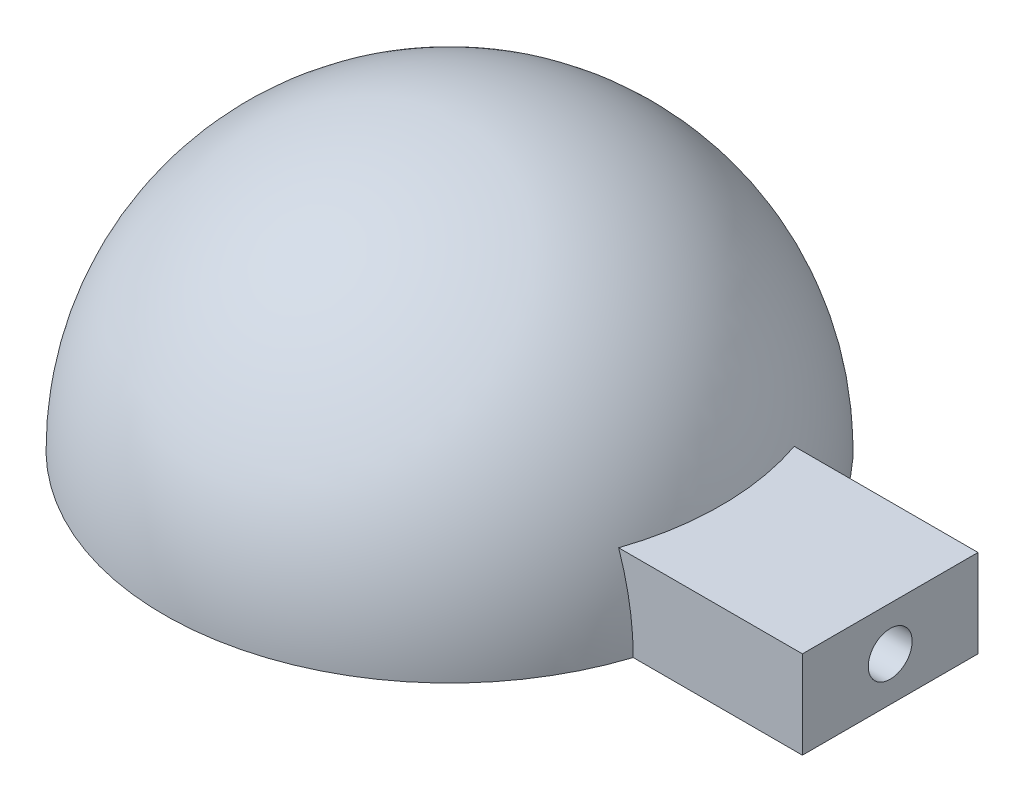
ISO-10303-21;
HEADER;
FILE_DESCRIPTION(('STEP AP214'),'2;1');
FILE_NAME('part.step','',(''),(''),'','','');
FILE_SCHEMA(('AUTOMOTIVE_DESIGN { 1 0 10303 214 1 1 1 1 }'));
ENDSEC;
DATA;
#1=APPLICATION_CONTEXT('core data for automotive mechanical design processes');
#2=APPLICATION_PROTOCOL_DEFINITION('international standard','automotive_design',2000,#1);
#3=PRODUCT_CONTEXT('',#1,'mechanical');
#4=PRODUCT('Part','Part','',(#3));
#5=PRODUCT_RELATED_PRODUCT_CATEGORY('part','',(#4));
#6=PRODUCT_DEFINITION_FORMATION('','',#4);
#7=PRODUCT_DEFINITION_CONTEXT('part definition',#1,'design');
#8=PRODUCT_DEFINITION('design','',#6,#7);
#9=PRODUCT_DEFINITION_SHAPE('','',#8);
#10=(LENGTH_UNIT() NAMED_UNIT(*) SI_UNIT(.MILLI.,.METRE.));
#11=(NAMED_UNIT(*) PLANE_ANGLE_UNIT() SI_UNIT($,.RADIAN.));
#12=(NAMED_UNIT(*) SI_UNIT($,.STERADIAN.) SOLID_ANGLE_UNIT());
#13=UNCERTAINTY_MEASURE_WITH_UNIT(LENGTH_MEASURE(1.E-05),#10,'distance_accuracy_value','');
#14=(GEOMETRIC_REPRESENTATION_CONTEXT(3) GLOBAL_UNCERTAINTY_ASSIGNED_CONTEXT((#13)) GLOBAL_UNIT_ASSIGNED_CONTEXT((#10,
#11,#12)) REPRESENTATION_CONTEXT('',''));
#15=CARTESIAN_POINT('',(0.,0.,0.));
#16=DIRECTION('',(0.,0.,1.));
#17=DIRECTION('',(1.,0.,0.));
#18=AXIS2_PLACEMENT_3D('',#15,#16,#17);
#19=CARTESIAN_POINT('',(0.,0.,0.));
#20=DIRECTION('',(0.,-1.,0.));
#21=DIRECTION('',(-1.,0.,0.));
#22=AXIS2_PLACEMENT_3D('',#19,#20,#21);
#23=SPHERICAL_SURFACE('',#22,6.5);
#24=CARTESIAN_POINT('',(0.,2.,0.));
#25=DIRECTION('',(0.,-1.,0.));
#26=DIRECTION('',(0.,0.,-1.));
#27=AXIS2_PLACEMENT_3D('',#24,#25,#26);
#28=CIRCLE('',#27,6.18465843842649);
#29=CARTESIAN_POINT('',(5.85234995535981,2.,-2.));
#30=VERTEX_POINT('',#29);
#31=CARTESIAN_POINT('',(5.85234995535981,2.,2.));
#32=VERTEX_POINT('',#31);
#33=EDGE_CURVE('E11',#30,#32,#28,.T.);
#34=ORIENTED_EDGE('',*,*,#33,.F.);
#35=CARTESIAN_POINT('',(0.,0.,-2.));
#36=DIRECTION('',(0.,0.,-1.));
#37=DIRECTION('',(-1.,0.,0.));
#38=AXIS2_PLACEMENT_3D('',#35,#36,#37);
#39=CIRCLE('',#38,6.18465843842649);
#40=CARTESIAN_POINT('',(6.18465843842649,0.,-2.));
#41=VERTEX_POINT('',#40);
#42=EDGE_CURVE('E57',#30,#41,#39,.T.);
#43=ORIENTED_EDGE('',*,*,#42,.T.);
#44=CARTESIAN_POINT('',(0.,0.,0.));
#45=DIRECTION('',(0.,-1.,0.));
#46=DIRECTION('',(0.,0.,-1.));
#47=AXIS2_PLACEMENT_3D('',#44,#45,#46);
#48=CIRCLE('',#47,6.5);
#49=CARTESIAN_POINT('',(6.18465843842649,0.,2.));
#50=VERTEX_POINT('',#49);
#51=EDGE_CURVE('E42',#50,#41,#48,.T.);
#52=ORIENTED_EDGE('',*,*,#51,.F.);
#53=CARTESIAN_POINT('',(0.,0.,2.));
#54=DIRECTION('',(0.,0.,-1.));
#55=DIRECTION('',(-1.,0.,0.));
#56=AXIS2_PLACEMENT_3D('',#53,#54,#55);
#57=CIRCLE('',#56,6.18465843842649);
#58=EDGE_CURVE('E107',#32,#50,#57,.T.);
#59=ORIENTED_EDGE('',*,*,#58,.F.);
#60=EDGE_LOOP('',(#34,#43,#52,#59));
#61=FACE_BOUND('',#60,.T.);
#62=ADVANCED_FACE('F35',(#61),#23,.T.);
#63=CARTESIAN_POINT('',(0.,0.,0.));
#64=DIRECTION('',(0.,-1.,0.));
#65=DIRECTION('',(0.,0.,-1.));
#66=AXIS2_PLACEMENT_3D('',#63,#64,#65);
#67=PLANE('',#66);
#68=ORIENTED_EDGE('',*,*,#51,.T.);
#69=DIRECTION('',(1.,0.,0.));
#70=VECTOR('',#69,1.);
#71=CARTESIAN_POINT('',(0.,0.,-2.));
#72=LINE('',#71,#70);
#73=CARTESIAN_POINT('',(10.0376342047566,0.,-2.));
#74=VERTEX_POINT('',#73);
#75=EDGE_CURVE('E95',#41,#74,#72,.T.);
#76=ORIENTED_EDGE('',*,*,#75,.T.);
#77=DIRECTION('',(0.,0.,-1.));
#78=VECTOR('',#77,1.);
#79=CARTESIAN_POINT('',(10.0376342047566,0.,0.));
#80=LINE('',#79,#78);
#81=CARTESIAN_POINT('',(10.0376342047566,0.,2.));
#82=VERTEX_POINT('',#81);
#83=EDGE_CURVE('E103',#82,#74,#80,.T.);
#84=ORIENTED_EDGE('',*,*,#83,.F.);
#85=DIRECTION('',(1.,0.,0.));
#86=VECTOR('',#85,1.);
#87=CARTESIAN_POINT('',(0.,0.,2.));
#88=LINE('',#87,#86);
#89=EDGE_CURVE('E49',#50,#82,#88,.T.);
#90=ORIENTED_EDGE('',*,*,#89,.F.);
#91=EDGE_LOOP('',(#68,#76,#84,#90));
#92=FACE_BOUND('',#91,.T.);
#93=CARTESIAN_POINT('',(0.,0.,0.));
#94=DIRECTION('',(0.,-1.,0.));
#95=DIRECTION('',(0.,0.,-1.));
#96=AXIS2_PLACEMENT_3D('',#93,#94,#95);
#97=CIRCLE('',#96,4.);
#98=CARTESIAN_POINT('',(0.,0.,-4.));
#99=VERTEX_POINT('',#98);
#100=EDGE_CURVE('E111',#99,#99,#97,.T.);
#101=ORIENTED_EDGE('',*,*,#100,.F.);
#102=EDGE_LOOP('',(#101));
#103=FACE_BOUND('',#102,.T.);
#104=ADVANCED_FACE('F114',(#92,#103),#67,.T.);
#105=CARTESIAN_POINT('',(0.,0.,0.));
#106=DIRECTION('',(0.,-1.,0.));
#107=DIRECTION('',(-1.,0.,0.));
#108=AXIS2_PLACEMENT_3D('',#105,#106,#107);
#109=SPHERICAL_SURFACE('',#108,4.);
#110=ORIENTED_EDGE('',*,*,#100,.T.);
#111=EDGE_LOOP('',(#110));
#112=FACE_BOUND('',#111,.T.);
#113=ADVANCED_FACE('F121',(#112),#109,.F.);
#114=CARTESIAN_POINT('',(0.,2.,0.));
#115=DIRECTION('',(0.,-1.,0.));
#116=DIRECTION('',(0.,0.,-1.));
#117=AXIS2_PLACEMENT_3D('',#114,#115,#116);
#118=PLANE('',#117);
#119=DIRECTION('',(1.,0.,0.));
#120=VECTOR('',#119,1.);
#121=CARTESIAN_POINT('',(0.,2.,-2.));
#122=LINE('',#121,#120);
#123=CARTESIAN_POINT('',(10.0376342047566,2.,-2.));
#124=VERTEX_POINT('',#123);
#125=EDGE_CURVE('E84',#30,#124,#122,.T.);
#126=ORIENTED_EDGE('',*,*,#125,.F.);
#127=ORIENTED_EDGE('',*,*,#33,.T.);
#128=DIRECTION('',(1.,0.,0.));
#129=VECTOR('',#128,1.);
#130=CARTESIAN_POINT('',(0.,2.,2.));
#131=LINE('',#130,#129);
#132=CARTESIAN_POINT('',(10.0376342047566,2.,2.));
#133=VERTEX_POINT('',#132);
#134=EDGE_CURVE('E75',#32,#133,#131,.T.);
#135=ORIENTED_EDGE('',*,*,#134,.T.);
#136=DIRECTION('',(0.,0.,-1.));
#137=VECTOR('',#136,1.);
#138=CARTESIAN_POINT('',(10.0376342047566,2.,0.));
#139=LINE('',#138,#137);
#140=EDGE_CURVE('E79',#133,#124,#139,.T.);
#141=ORIENTED_EDGE('',*,*,#140,.T.);
#142=EDGE_LOOP('',(#126,#127,#135,#141));
#143=FACE_BOUND('',#142,.T.);
#144=ADVANCED_FACE('F77',(#143),#118,.F.);
#145=CARTESIAN_POINT('',(0.,2.,-2.));
#146=DIRECTION('',(0.,0.,-1.));
#147=DIRECTION('',(-1.,0.,0.));
#148=AXIS2_PLACEMENT_3D('',#145,#146,#147);
#149=PLANE('',#148);
#150=ORIENTED_EDGE('',*,*,#42,.F.);
#151=ORIENTED_EDGE('',*,*,#125,.T.);
#152=DIRECTION('',(0.,-1.,0.));
#153=VECTOR('',#152,1.);
#154=CARTESIAN_POINT('',(10.0376342047566,2.,-2.));
#155=LINE('',#154,#153);
#156=EDGE_CURVE('E91',#124,#74,#155,.T.);
#157=ORIENTED_EDGE('',*,*,#156,.T.);
#158=ORIENTED_EDGE('',*,*,#75,.F.);
#159=EDGE_LOOP('',(#150,#151,#157,#158));
#160=FACE_BOUND('',#159,.T.);
#161=ADVANCED_FACE('F134',(#160),#149,.T.);
#162=CARTESIAN_POINT('',(0.,2.,2.));
#163=DIRECTION('',(0.,0.,-1.));
#164=DIRECTION('',(-1.,0.,0.));
#165=AXIS2_PLACEMENT_3D('',#162,#163,#164);
#166=PLANE('',#165);
#167=ORIENTED_EDGE('',*,*,#134,.F.);
#168=ORIENTED_EDGE('',*,*,#58,.T.);
#169=ORIENTED_EDGE('',*,*,#89,.T.);
#170=DIRECTION('',(0.,-1.,0.));
#171=VECTOR('',#170,1.);
#172=CARTESIAN_POINT('',(10.0376342047566,2.,2.));
#173=LINE('',#172,#171);
#174=EDGE_CURVE('E87',#133,#82,#173,.T.);
#175=ORIENTED_EDGE('',*,*,#174,.F.);
#176=EDGE_LOOP('',(#167,#168,#169,#175));
#177=FACE_BOUND('',#176,.T.);
#178=ADVANCED_FACE('F88',(#177),#166,.F.);
#179=CARTESIAN_POINT('',(10.0376342047566,2.,0.));
#180=DIRECTION('',(-1.,0.,0.));
#181=DIRECTION('',(0.,0.,1.));
#182=AXIS2_PLACEMENT_3D('',#179,#180,#181);
#183=PLANE('',#182);
#184=CARTESIAN_POINT('',(10.0376342047566,1.,0.));
#185=DIRECTION('',(1.,0.,0.));
#186=DIRECTION('',(0.,0.,-1.));
#187=AXIS2_PLACEMENT_3D('',#184,#185,#186);
#188=CIRCLE('',#187,0.5);
#189=CARTESIAN_POINT('',(10.0376342047566,1.,-0.5));
#190=VERTEX_POINT('',#189);
#191=EDGE_CURVE('E99',#190,#190,#188,.T.);
#192=ORIENTED_EDGE('',*,*,#191,.F.);
#193=EDGE_LOOP('',(#192));
#194=FACE_BOUND('',#193,.T.);
#195=ORIENTED_EDGE('',*,*,#83,.T.);
#196=ORIENTED_EDGE('',*,*,#156,.F.);
#197=ORIENTED_EDGE('',*,*,#140,.F.);
#198=ORIENTED_EDGE('',*,*,#174,.T.);
#199=EDGE_LOOP('',(#195,#196,#197,#198));
#200=FACE_BOUND('',#199,.T.);
#201=ADVANCED_FACE('F93',(#194,#200),#183,.F.);
#202=CARTESIAN_POINT('',(8.0376342047566,1.,0.));
#203=DIRECTION('',(1.,0.,0.));
#204=DIRECTION('',(0.,0.,-1.));
#205=AXIS2_PLACEMENT_3D('',#202,#203,#204);
#206=CYLINDRICAL_SURFACE('',#205,0.5);
#207=CARTESIAN_POINT('',(8.0376342047566,1.,0.));
#208=DIRECTION('',(1.,0.,0.));
#209=DIRECTION('',(0.,0.,-1.));
#210=AXIS2_PLACEMENT_3D('',#207,#208,#209);
#211=CIRCLE('',#210,0.5);
#212=CARTESIAN_POINT('',(8.0376342047566,1.,-0.5));
#213=VERTEX_POINT('',#212);
#214=EDGE_CURVE('E105',#213,#213,#211,.T.);
#215=ORIENTED_EDGE('',*,*,#214,.F.);
#216=EDGE_LOOP('',(#215));
#217=FACE_BOUND('',#216,.T.);
#218=ORIENTED_EDGE('',*,*,#191,.T.);
#219=EDGE_LOOP('',(#218));
#220=FACE_BOUND('',#219,.T.);
#221=ADVANCED_FACE('F130',(#217,#220),#206,.F.);
#222=CARTESIAN_POINT('',(8.0376342047566,1.,0.));
#223=DIRECTION('',(1.,0.,0.));
#224=DIRECTION('',(0.,0.,-1.));
#225=AXIS2_PLACEMENT_3D('',#222,#223,#224);
#226=PLANE('',#225);
#227=ORIENTED_EDGE('',*,*,#214,.T.);
#228=EDGE_LOOP('',(#227));
#229=FACE_BOUND('',#228,.T.);
#230=ADVANCED_FACE('F141',(#229),#226,.T.);
#231=CLOSED_SHELL('',(#62,#104,#113,#144,#161,#178,#201,#221,#230));
#232=MANIFOLD_SOLID_BREP('B2',#231);
#233=ADVANCED_BREP_SHAPE_REPRESENTATION('',(#18,#232),#14);
#234=SHAPE_DEFINITION_REPRESENTATION(#9,#233);
ENDSEC;
END-ISO-10303-21;
